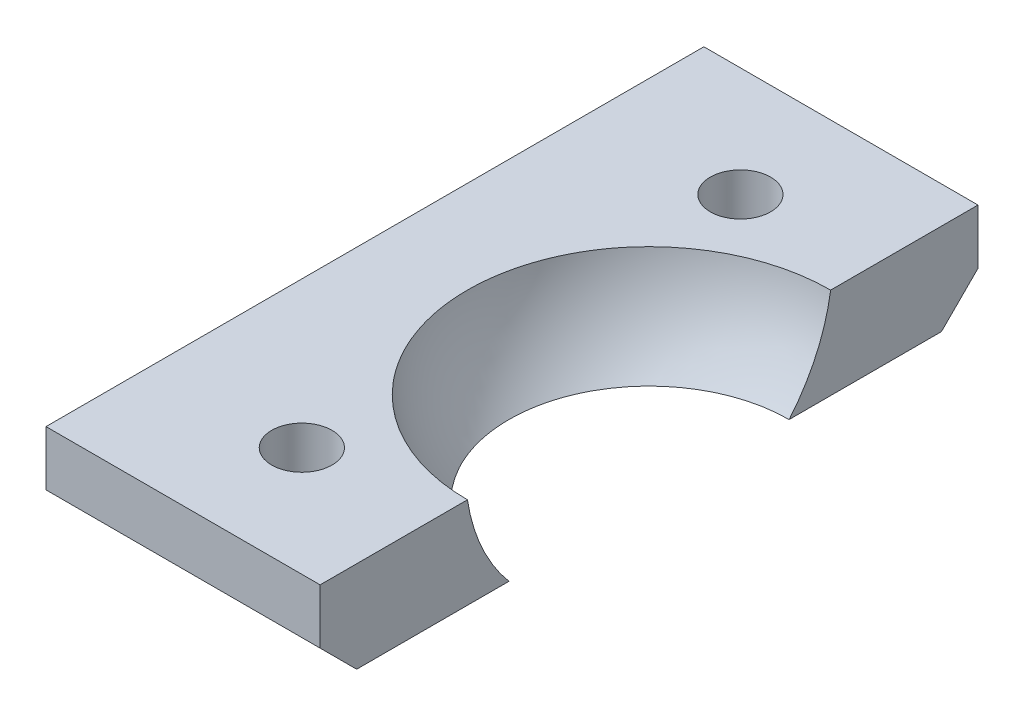
ISO-10303-21;
HEADER;
FILE_DESCRIPTION(('STEP AP214'),'2;1');
FILE_NAME('part.step','',(''),(''),'','','');
FILE_SCHEMA(('AUTOMOTIVE_DESIGN { 1 0 10303 214 1 1 1 1 }'));
ENDSEC;
DATA;
#1=APPLICATION_CONTEXT('core data for automotive mechanical design processes');
#2=APPLICATION_PROTOCOL_DEFINITION('international standard','automotive_design',2000,#1);
#3=PRODUCT_CONTEXT('',#1,'mechanical');
#4=PRODUCT('Part','Part','',(#3));
#5=PRODUCT_RELATED_PRODUCT_CATEGORY('part','',(#4));
#6=PRODUCT_DEFINITION_FORMATION('','',#4);
#7=PRODUCT_DEFINITION_CONTEXT('part definition',#1,'design');
#8=PRODUCT_DEFINITION('design','',#6,#7);
#9=PRODUCT_DEFINITION_SHAPE('','',#8);
#10=(LENGTH_UNIT() NAMED_UNIT(*) SI_UNIT(.MILLI.,.METRE.));
#11=(NAMED_UNIT(*) PLANE_ANGLE_UNIT() SI_UNIT($,.RADIAN.));
#12=(NAMED_UNIT(*) SI_UNIT($,.STERADIAN.) SOLID_ANGLE_UNIT());
#13=UNCERTAINTY_MEASURE_WITH_UNIT(LENGTH_MEASURE(1.E-05),#10,'distance_accuracy_value','');
#14=(GEOMETRIC_REPRESENTATION_CONTEXT(3) GLOBAL_UNCERTAINTY_ASSIGNED_CONTEXT((#13)) GLOBAL_UNIT_ASSIGNED_CONTEXT((#10,
#11,#12)) REPRESENTATION_CONTEXT('',''));
#15=CARTESIAN_POINT('',(0.,0.,0.));
#16=DIRECTION('',(0.,0.,1.));
#17=DIRECTION('',(1.,0.,0.));
#18=AXIS2_PLACEMENT_3D('',#15,#16,#17);
#19=CARTESIAN_POINT('',(0.,5.,0.));
#20=DIRECTION('',(1.,0.,0.));
#21=DIRECTION('',(0.,0.,-1.));
#22=AXIS2_PLACEMENT_3D('',#19,#20,#21);
#23=PLANE('',#22);
#24=DIRECTION('',(0.,-1.,0.));
#25=VECTOR('',#24,1.);
#26=CARTESIAN_POINT('',(0.,5.,7.));
#27=LINE('',#26,#25);
#28=CARTESIAN_POINT('',(0.,5.,7.));
#29=VERTEX_POINT('',#28);
#30=CARTESIAN_POINT('',(0.,2.,7.));
#31=VERTEX_POINT('',#30);
#32=EDGE_CURVE('E130',#29,#31,#27,.T.);
#33=ORIENTED_EDGE('',*,*,#32,.T.);
#34=DIRECTION('',(0.,0.,1.));
#35=VECTOR('',#34,1.);
#36=CARTESIAN_POINT('',(0.,2.,0.));
#37=LINE('',#36,#35);
#38=CARTESIAN_POINT('',(0.,2.,43.));
#39=VERTEX_POINT('',#38);
#40=EDGE_CURVE('E60',#31,#39,#37,.T.);
#41=ORIENTED_EDGE('',*,*,#40,.T.);
#42=DIRECTION('',(0.,1.,0.));
#43=VECTOR('',#42,1.);
#44=CARTESIAN_POINT('',(0.,5.,43.));
#45=LINE('',#44,#43);
#46=CARTESIAN_POINT('',(0.,5.,43.));
#47=VERTEX_POINT('',#46);
#48=EDGE_CURVE('E131',#39,#47,#45,.T.);
#49=ORIENTED_EDGE('',*,*,#48,.T.);
#50=DIRECTION('',(0.,0.,1.));
#51=VECTOR('',#50,1.);
#52=CARTESIAN_POINT('',(0.,5.,0.));
#53=LINE('',#52,#51);
#54=EDGE_CURVE('E113',#29,#47,#53,.T.);
#55=ORIENTED_EDGE('',*,*,#54,.F.);
#56=EDGE_LOOP('',(#33,#41,#49,#55));
#57=FACE_BOUND('',#56,.T.);
#58=ADVANCED_FACE('F35',(#57),#23,.F.);
#59=CARTESIAN_POINT('',(0.,5.,0.));
#60=DIRECTION('',(0.,1.,0.));
#61=DIRECTION('',(0.,0.,1.));
#62=AXIS2_PLACEMENT_3D('',#59,#60,#61);
#63=PLANE('',#62);
#64=DIRECTION('',(0.,0.,1.));
#65=VECTOR('',#64,1.);
#66=CARTESIAN_POINT('',(15.,5.,4.87342962280523));
#67=LINE('',#66,#65);
#68=CARTESIAN_POINT('',(15.,5.,7.));
#69=VERTEX_POINT('',#68);
#70=CARTESIAN_POINT('',(15.,5.,15.0625707549689));
#71=VERTEX_POINT('',#70);
#72=EDGE_CURVE('E106',#69,#71,#67,.T.);
#73=ORIENTED_EDGE('',*,*,#72,.F.);
#74=DIRECTION('',(1.,0.,0.));
#75=VECTOR('',#74,1.);
#76=CARTESIAN_POINT('',(-6.08409732085235,5.,7.));
#77=LINE('',#76,#75);
#78=EDGE_CURVE('E121',#29,#69,#77,.T.);
#79=ORIENTED_EDGE('',*,*,#78,.F.);
#80=ORIENTED_EDGE('',*,*,#54,.T.);
#81=DIRECTION('',(-1.,0.,0.));
#82=VECTOR('',#81,1.);
#83=CARTESIAN_POINT('',(-8.24656884093977,5.,43.));
#84=LINE('',#83,#82);
#85=CARTESIAN_POINT('',(15.,5.,43.));
#86=VERTEX_POINT('',#85);
#87=EDGE_CURVE('E132',#86,#47,#84,.T.);
#88=ORIENTED_EDGE('',*,*,#87,.F.);
#89=CARTESIAN_POINT('',(15.,5.,34.9374292450311));
#90=VERTEX_POINT('',#89);
#91=EDGE_CURVE('E127',#90,#86,#67,.T.);
#92=ORIENTED_EDGE('',*,*,#91,.F.);
#93=CARTESIAN_POINT('',(15.,5.,25.));
#94=DIRECTION('',(0.,1.,0.));
#95=DIRECTION('',(0.,0.,1.));
#96=AXIS2_PLACEMENT_3D('',#93,#94,#95);
#97=CIRCLE('',#96,9.93742924503113);
#98=EDGE_CURVE('E125',#71,#90,#97,.T.);
#99=ORIENTED_EDGE('',*,*,#98,.F.);
#100=EDGE_LOOP('',(#73,#79,#80,#88,#92,#99));
#101=FACE_BOUND('',#100,.T.);
#102=CARTESIAN_POINT('',(8.,5.,13.));
#103=DIRECTION('',(0.,-1.,0.));
#104=DIRECTION('',(0.,0.,-1.));
#105=AXIS2_PLACEMENT_3D('',#102,#103,#104);
#106=CIRCLE('',#105,1.65);
#107=CARTESIAN_POINT('',(8.,5.,11.35));
#108=VERTEX_POINT('',#107);
#109=EDGE_CURVE('E144',#108,#108,#106,.T.);
#110=ORIENTED_EDGE('',*,*,#109,.T.);
#111=EDGE_LOOP('',(#110));
#112=FACE_BOUND('',#111,.T.);
#113=CARTESIAN_POINT('',(8.,5.,37.));
#114=DIRECTION('',(0.,-1.,0.));
#115=DIRECTION('',(0.,0.,-1.));
#116=AXIS2_PLACEMENT_3D('',#113,#114,#115);
#117=CIRCLE('',#116,1.65);
#118=CARTESIAN_POINT('',(8.,5.,35.35));
#119=VERTEX_POINT('',#118);
#120=EDGE_CURVE('E150',#119,#119,#117,.T.);
#121=ORIENTED_EDGE('',*,*,#120,.T.);
#122=EDGE_LOOP('',(#121));
#123=FACE_BOUND('',#122,.T.);
#124=ADVANCED_FACE('F118',(#101,#112,#123),#63,.T.);
#125=CARTESIAN_POINT('',(0.,0.,0.));
#126=DIRECTION('',(0.,1.,0.));
#127=DIRECTION('',(0.,0.,1.));
#128=AXIS2_PLACEMENT_3D('',#125,#126,#127);
#129=PLANE('',#128);
#130=CARTESIAN_POINT('',(8.,0.,13.));
#131=DIRECTION('',(0.,-1.,0.));
#132=DIRECTION('',(0.,0.,-1.));
#133=AXIS2_PLACEMENT_3D('',#130,#131,#132);
#134=CIRCLE('',#133,1.65);
#135=CARTESIAN_POINT('',(8.,0.,11.35));
#136=VERTEX_POINT('',#135);
#137=EDGE_CURVE('E143',#136,#136,#134,.T.);
#138=ORIENTED_EDGE('',*,*,#137,.F.);
#139=EDGE_LOOP('',(#138));
#140=FACE_BOUND('',#139,.T.);
#141=CARTESIAN_POINT('',(8.,0.,37.));
#142=DIRECTION('',(0.,-1.,0.));
#143=DIRECTION('',(0.,0.,-1.));
#144=AXIS2_PLACEMENT_3D('',#141,#142,#143);
#145=CIRCLE('',#144,1.65);
#146=CARTESIAN_POINT('',(8.,0.,35.35));
#147=VERTEX_POINT('',#146);
#148=EDGE_CURVE('E147',#147,#147,#145,.T.);
#149=ORIENTED_EDGE('',*,*,#148,.F.);
#150=EDGE_LOOP('',(#149));
#151=FACE_BOUND('',#150,.T.);
#152=DIRECTION('',(0.,0.,-1.));
#153=VECTOR('',#152,1.);
#154=CARTESIAN_POINT('',(1.99999999999999,0.,0.));
#155=LINE('',#154,#153);
#156=CARTESIAN_POINT('',(1.99999999999999,0.,41.));
#157=VERTEX_POINT('',#156);
#158=CARTESIAN_POINT('',(1.99999999999999,0.,8.99999999999999));
#159=VERTEX_POINT('',#158);
#160=EDGE_CURVE('E161',#157,#159,#155,.T.);
#161=ORIENTED_EDGE('',*,*,#160,.T.);
#162=DIRECTION('',(1.,0.,0.));
#163=VECTOR('',#162,1.);
#164=CARTESIAN_POINT('',(0.,0.,8.99999999999999));
#165=LINE('',#164,#163);
#166=CARTESIAN_POINT('',(15.,0.,8.99999999999999));
#167=VERTEX_POINT('',#166);
#168=EDGE_CURVE('E163',#159,#167,#165,.T.);
#169=ORIENTED_EDGE('',*,*,#168,.T.);
#170=DIRECTION('',(0.,0.,1.));
#171=VECTOR('',#170,1.);
#172=CARTESIAN_POINT('',(15.,0.,4.87342962280523));
#173=LINE('',#172,#171);
#174=CARTESIAN_POINT('',(15.,0.,17.3349820613387));
#175=VERTEX_POINT('',#174);
#176=EDGE_CURVE('E184',#167,#175,#173,.T.);
#177=ORIENTED_EDGE('',*,*,#176,.T.);
#178=CARTESIAN_POINT('',(15.,0.,25.));
#179=DIRECTION('',(0.,1.,0.));
#180=DIRECTION('',(0.,0.,1.));
#181=AXIS2_PLACEMENT_3D('',#178,#179,#180);
#182=CIRCLE('',#181,7.66501793866133);
#183=CARTESIAN_POINT('',(15.,0.,32.6650179386613));
#184=VERTEX_POINT('',#183);
#185=EDGE_CURVE('E153',#175,#184,#182,.T.);
#186=ORIENTED_EDGE('',*,*,#185,.T.);
#187=CARTESIAN_POINT('',(15.,0.,41.));
#188=VERTEX_POINT('',#187);
#189=EDGE_CURVE('E126',#184,#188,#173,.T.);
#190=ORIENTED_EDGE('',*,*,#189,.T.);
#191=DIRECTION('',(-1.,0.,0.));
#192=VECTOR('',#191,1.);
#193=CARTESIAN_POINT('',(0.,0.,41.));
#194=LINE('',#193,#192);
#195=EDGE_CURVE('E112',#188,#157,#194,.T.);
#196=ORIENTED_EDGE('',*,*,#195,.T.);
#197=EDGE_LOOP('',(#161,#169,#177,#186,#190,#196));
#198=FACE_BOUND('',#197,.T.);
#199=ADVANCED_FACE('F188',(#140,#151,#198),#129,.F.);
#200=CARTESIAN_POINT('',(15.,6.5,25.));
#201=DIRECTION('',(-1.,0.,0.));
#202=DIRECTION('',(0.,0.,-1.));
#203=AXIS2_PLACEMENT_3D('',#200,#201,#202);
#204=SPHERICAL_SURFACE('',#203,10.05);
#205=ORIENTED_EDGE('',*,*,#98,.T.);
#206=CARTESIAN_POINT('',(15.,6.5,25.));
#207=DIRECTION('',(-1.,0.,0.));
#208=DIRECTION('',(0.,0.,1.));
#209=AXIS2_PLACEMENT_3D('',#206,#207,#208);
#210=CIRCLE('',#209,10.05);
#211=EDGE_CURVE('E136',#90,#184,#210,.F.);
#212=ORIENTED_EDGE('',*,*,#211,.T.);
#213=ORIENTED_EDGE('',*,*,#185,.F.);
#214=EDGE_CURVE('E139',#175,#71,#210,.F.);
#215=ORIENTED_EDGE('',*,*,#214,.T.);
#216=EDGE_LOOP('',(#205,#212,#213,#215));
#217=FACE_BOUND('',#216,.T.);
#218=ADVANCED_FACE('F195',(#217),#204,.F.);
#219=CARTESIAN_POINT('',(8.,5.,37.));
#220=DIRECTION('',(0.,-1.,0.));
#221=DIRECTION('',(0.,0.,-1.));
#222=AXIS2_PLACEMENT_3D('',#219,#220,#221);
#223=CYLINDRICAL_SURFACE('',#222,1.65);
#224=ORIENTED_EDGE('',*,*,#120,.F.);
#225=EDGE_LOOP('',(#224));
#226=FACE_BOUND('',#225,.T.);
#227=ORIENTED_EDGE('',*,*,#148,.T.);
#228=EDGE_LOOP('',(#227));
#229=FACE_BOUND('',#228,.T.);
#230=ADVANCED_FACE('F233',(#226,#229),#223,.F.);
#231=CARTESIAN_POINT('',(8.,5.,13.));
#232=DIRECTION('',(0.,-1.,0.));
#233=DIRECTION('',(0.,0.,-1.));
#234=AXIS2_PLACEMENT_3D('',#231,#232,#233);
#235=CYLINDRICAL_SURFACE('',#234,1.65);
#236=ORIENTED_EDGE('',*,*,#109,.F.);
#237=EDGE_LOOP('',(#236));
#238=FACE_BOUND('',#237,.T.);
#239=ORIENTED_EDGE('',*,*,#137,.T.);
#240=EDGE_LOOP('',(#239));
#241=FACE_BOUND('',#240,.T.);
#242=ADVANCED_FACE('F230',(#238,#241),#235,.F.);
#243=CARTESIAN_POINT('',(-8.24656884093977,0.,43.));
#244=DIRECTION('',(0.,0.,-1.));
#245=DIRECTION('',(-1.,0.,0.));
#246=AXIS2_PLACEMENT_3D('',#243,#244,#245);
#247=PLANE('',#246);
#248=ORIENTED_EDGE('',*,*,#48,.F.);
#249=DIRECTION('',(1.,0.,0.));
#250=VECTOR('',#249,1.);
#251=CARTESIAN_POINT('',(-8.24656884093977,2.,43.));
#252=LINE('',#251,#250);
#253=CARTESIAN_POINT('',(15.,2.,43.));
#254=VERTEX_POINT('',#253);
#255=EDGE_CURVE('E45',#39,#254,#252,.T.);
#256=ORIENTED_EDGE('',*,*,#255,.T.);
#257=DIRECTION('',(0.,1.,0.));
#258=VECTOR('',#257,1.);
#259=CARTESIAN_POINT('',(15.,0.,43.));
#260=LINE('',#259,#258);
#261=EDGE_CURVE('E183',#254,#86,#260,.T.);
#262=ORIENTED_EDGE('',*,*,#261,.T.);
#263=ORIENTED_EDGE('',*,*,#87,.T.);
#264=EDGE_LOOP('',(#248,#256,#262,#263));
#265=FACE_BOUND('',#264,.T.);
#266=ADVANCED_FACE('F197',(#265),#247,.F.);
#267=CARTESIAN_POINT('',(-6.08409732085235,0.,7.));
#268=DIRECTION('',(0.,0.,1.));
#269=DIRECTION('',(1.,0.,0.));
#270=AXIS2_PLACEMENT_3D('',#267,#268,#269);
#271=PLANE('',#270);
#272=DIRECTION('',(0.,-1.,0.));
#273=VECTOR('',#272,1.);
#274=CARTESIAN_POINT('',(15.,0.,7.));
#275=LINE('',#274,#273);
#276=CARTESIAN_POINT('',(15.,2.,7.));
#277=VERTEX_POINT('',#276);
#278=EDGE_CURVE('E101',#69,#277,#275,.T.);
#279=ORIENTED_EDGE('',*,*,#278,.T.);
#280=DIRECTION('',(-1.,0.,0.));
#281=VECTOR('',#280,1.);
#282=CARTESIAN_POINT('',(-6.08409732085235,2.,7.));
#283=LINE('',#282,#281);
#284=EDGE_CURVE('E167',#277,#31,#283,.T.);
#285=ORIENTED_EDGE('',*,*,#284,.T.);
#286=ORIENTED_EDGE('',*,*,#32,.F.);
#287=ORIENTED_EDGE('',*,*,#78,.T.);
#288=EDGE_LOOP('',(#279,#285,#286,#287));
#289=FACE_BOUND('',#288,.T.);
#290=ADVANCED_FACE('F129',(#289),#271,.F.);
#291=CARTESIAN_POINT('',(15.,0.,4.87342962280523));
#292=DIRECTION('',(-1.,0.,0.));
#293=DIRECTION('',(0.,0.,1.));
#294=AXIS2_PLACEMENT_3D('',#291,#292,#293);
#295=PLANE('',#294);
#296=ORIENTED_EDGE('',*,*,#176,.F.);
#297=DIRECTION('',(0.,-0.707106781186549,0.707106781186546));
#298=VECTOR('',#297,1.);
#299=CARTESIAN_POINT('',(15.,0.,8.99999999999999));
#300=LINE('',#299,#298);
#301=EDGE_CURVE('E108',#167,#277,#300,.F.);
#302=ORIENTED_EDGE('',*,*,#301,.T.);
#303=ORIENTED_EDGE('',*,*,#278,.F.);
#304=ORIENTED_EDGE('',*,*,#72,.T.);
#305=ORIENTED_EDGE('',*,*,#214,.F.);
#306=EDGE_LOOP('',(#296,#302,#303,#304,#305));
#307=FACE_BOUND('',#306,.T.);
#308=ADVANCED_FACE('F104',(#307),#295,.F.);
#309=ORIENTED_EDGE('',*,*,#261,.F.);
#310=DIRECTION('',(0.,0.707106781186549,0.707106781186546));
#311=VECTOR('',#310,1.);
#312=CARTESIAN_POINT('',(15.,0.,41.));
#313=LINE('',#312,#311);
#314=EDGE_CURVE('E11',#254,#188,#313,.F.);
#315=ORIENTED_EDGE('',*,*,#314,.T.);
#316=ORIENTED_EDGE('',*,*,#189,.F.);
#317=ORIENTED_EDGE('',*,*,#211,.F.);
#318=ORIENTED_EDGE('',*,*,#91,.T.);
#319=EDGE_LOOP('',(#309,#315,#316,#317,#318));
#320=FACE_BOUND('',#319,.T.);
#321=ADVANCED_FACE('F196',(#320),#295,.F.);
#322=CARTESIAN_POINT('',(0.,0.,41.));
#323=DIRECTION('',(0.,0.707106781186546,-0.707106781186549));
#324=DIRECTION('',(-1.,0.,0.));
#325=AXIS2_PLACEMENT_3D('',#322,#323,#324);
#326=PLANE('',#325);
#327=ORIENTED_EDGE('',*,*,#314,.F.);
#328=ORIENTED_EDGE('',*,*,#255,.F.);
#329=DIRECTION('',(0.577350269189625,-0.577350269189627,-0.577350269189625));
#330=VECTOR('',#329,1.);
#331=CARTESIAN_POINT('',(1.33333333333333,0.666666666666666,41.6666666666667));
#332=LINE('',#331,#330);
#333=EDGE_CURVE('E40',#157,#39,#332,.F.);
#334=ORIENTED_EDGE('',*,*,#333,.F.);
#335=ORIENTED_EDGE('',*,*,#195,.F.);
#336=EDGE_LOOP('',(#327,#328,#334,#335));
#337=FACE_BOUND('',#336,.T.);
#338=ADVANCED_FACE('F38',(#337),#326,.F.);
#339=CARTESIAN_POINT('',(0.,2.,0.));
#340=DIRECTION('',(0.707106781186549,0.707106781186546,0.));
#341=DIRECTION('',(0.,0.,1.));
#342=AXIS2_PLACEMENT_3D('',#339,#340,#341);
#343=PLANE('',#342);
#344=ORIENTED_EDGE('',*,*,#333,.T.);
#345=ORIENTED_EDGE('',*,*,#40,.F.);
#346=DIRECTION('',(0.577350269189625,-0.577350269189627,0.577350269189625));
#347=VECTOR('',#346,1.);
#348=CARTESIAN_POINT('',(-2.33333333333333,4.33333333333334,4.66666666666667));
#349=LINE('',#348,#347);
#350=EDGE_CURVE('E170',#159,#31,#349,.F.);
#351=ORIENTED_EDGE('',*,*,#350,.F.);
#352=ORIENTED_EDGE('',*,*,#160,.F.);
#353=EDGE_LOOP('',(#344,#345,#351,#352));
#354=FACE_BOUND('',#353,.T.);
#355=ADVANCED_FACE('F193',(#354),#343,.F.);
#356=CARTESIAN_POINT('',(0.,0.,8.99999999999999));
#357=DIRECTION('',(0.,0.707106781186546,0.707106781186549));
#358=DIRECTION('',(1.,0.,0.));
#359=AXIS2_PLACEMENT_3D('',#356,#357,#358);
#360=PLANE('',#359);
#361=ORIENTED_EDGE('',*,*,#350,.T.);
#362=ORIENTED_EDGE('',*,*,#284,.F.);
#363=ORIENTED_EDGE('',*,*,#301,.F.);
#364=ORIENTED_EDGE('',*,*,#168,.F.);
#365=EDGE_LOOP('',(#361,#362,#363,#364));
#366=FACE_BOUND('',#365,.T.);
#367=ADVANCED_FACE('F207',(#366),#360,.F.);
#368=CLOSED_SHELL('',(#58,#124,#199,#218,#230,#242,#266,#290,#308,#321,#338,#355,#367));
#369=MANIFOLD_SOLID_BREP('B2',#368);
#370=ADVANCED_BREP_SHAPE_REPRESENTATION('',(#18,#369),#14);
#371=SHAPE_DEFINITION_REPRESENTATION(#9,#370);
ENDSEC;
END-ISO-10303-21;
